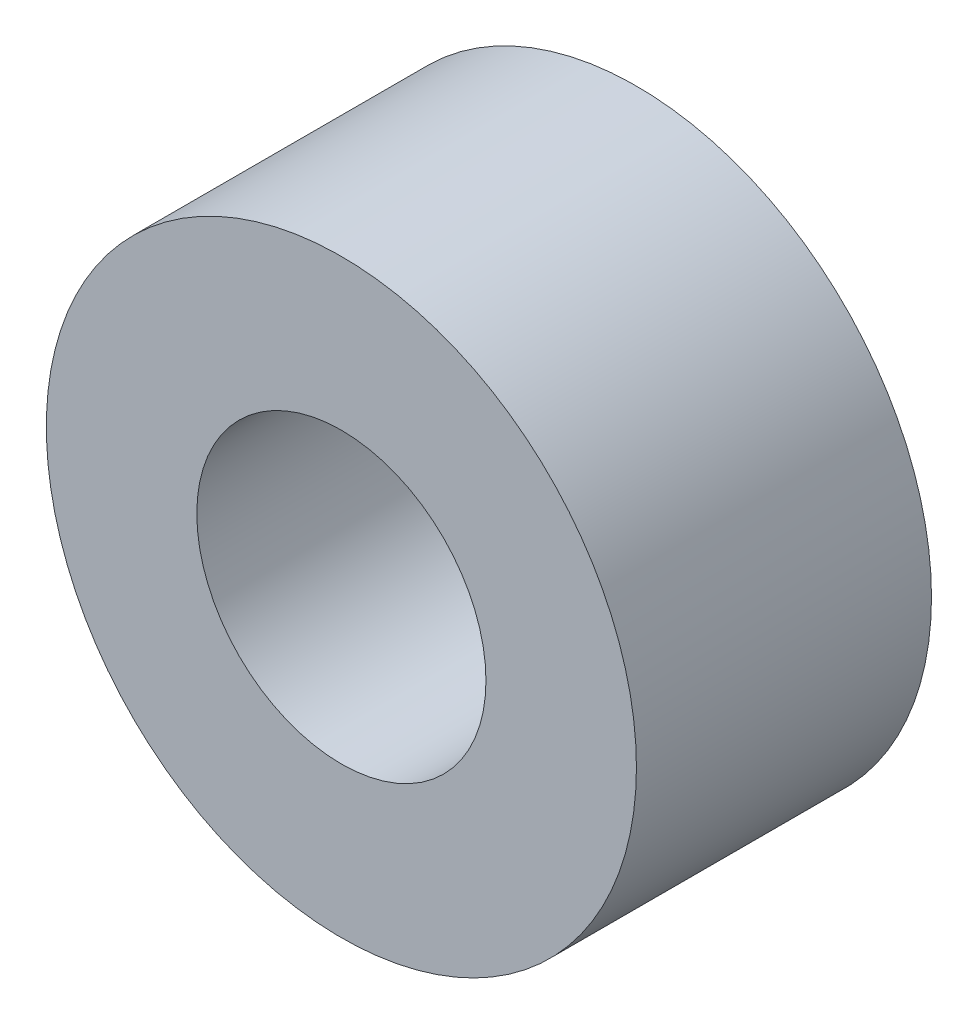
ISO-10303-21;
HEADER;
FILE_DESCRIPTION(('STEP AP214'),'2;1');
FILE_NAME('part.step','',(''),(''),'','','');
FILE_SCHEMA(('AUTOMOTIVE_DESIGN { 1 0 10303 214 1 1 1 1 }'));
ENDSEC;
DATA;
#1=APPLICATION_CONTEXT('core data for automotive mechanical design processes');
#2=APPLICATION_PROTOCOL_DEFINITION('international standard','automotive_design',2000,#1);
#3=PRODUCT_CONTEXT('',#1,'mechanical');
#4=PRODUCT('Part','Part','',(#3));
#5=PRODUCT_RELATED_PRODUCT_CATEGORY('part','',(#4));
#6=PRODUCT_DEFINITION_FORMATION('','',#4);
#7=PRODUCT_DEFINITION_CONTEXT('part definition',#1,'design');
#8=PRODUCT_DEFINITION('design','',#6,#7);
#9=PRODUCT_DEFINITION_SHAPE('','',#8);
#10=(LENGTH_UNIT() NAMED_UNIT(*) SI_UNIT(.MILLI.,.METRE.));
#11=(NAMED_UNIT(*) PLANE_ANGLE_UNIT() SI_UNIT($,.RADIAN.));
#12=(NAMED_UNIT(*) SI_UNIT($,.STERADIAN.) SOLID_ANGLE_UNIT());
#13=UNCERTAINTY_MEASURE_WITH_UNIT(LENGTH_MEASURE(1.E-05),#10,'distance_accuracy_value','');
#14=(GEOMETRIC_REPRESENTATION_CONTEXT(3) GLOBAL_UNCERTAINTY_ASSIGNED_CONTEXT((#13)) GLOBAL_UNIT_ASSIGNED_CONTEXT((#10,
#11,#12)) REPRESENTATION_CONTEXT('',''));
#15=CARTESIAN_POINT('',(0.,0.,0.));
#16=DIRECTION('',(0.,0.,1.));
#17=DIRECTION('',(1.,0.,0.));
#18=AXIS2_PLACEMENT_3D('',#15,#16,#17);
#19=CARTESIAN_POINT('',(0.,0.,5.));
#20=DIRECTION('',(0.,0.,1.));
#21=DIRECTION('',(1.,0.,0.));
#22=AXIS2_PLACEMENT_3D('',#19,#20,#21);
#23=PLANE('',#22);
#24=CARTESIAN_POINT('',(0.,0.,5.));
#25=DIRECTION('',(0.,0.,1.));
#26=DIRECTION('',(1.,0.,0.));
#27=AXIS2_PLACEMENT_3D('',#24,#25,#26);
#28=CIRCLE('',#27,5.);
#29=CARTESIAN_POINT('',(5.,0.,5.));
#30=VERTEX_POINT('',#29);
#31=EDGE_CURVE('E10',#30,#30,#28,.T.);
#32=ORIENTED_EDGE('',*,*,#31,.T.);
#33=EDGE_LOOP('',(#32));
#34=FACE_BOUND('',#33,.T.);
#35=CARTESIAN_POINT('',(0.,0.,5.));
#36=DIRECTION('',(0.,0.,1.));
#37=DIRECTION('',(1.,0.,0.));
#38=AXIS2_PLACEMENT_3D('',#35,#36,#37);
#39=CIRCLE('',#38,2.45);
#40=CARTESIAN_POINT('',(2.45,0.,5.));
#41=VERTEX_POINT('',#40);
#42=EDGE_CURVE('E56',#41,#41,#39,.T.);
#43=ORIENTED_EDGE('',*,*,#42,.F.);
#44=EDGE_LOOP('',(#43));
#45=FACE_BOUND('',#44,.T.);
#46=ADVANCED_FACE('F43',(#34,#45),#23,.T.);
#47=CARTESIAN_POINT('',(0.,0.,0.));
#48=DIRECTION('',(0.,0.,1.));
#49=DIRECTION('',(1.,0.,0.));
#50=AXIS2_PLACEMENT_3D('',#47,#48,#49);
#51=PLANE('',#50);
#52=CARTESIAN_POINT('',(0.,0.,0.));
#53=DIRECTION('',(0.,0.,1.));
#54=DIRECTION('',(1.,0.,0.));
#55=AXIS2_PLACEMENT_3D('',#52,#53,#54);
#56=CIRCLE('',#55,5.);
#57=CARTESIAN_POINT('',(5.,0.,0.));
#58=VERTEX_POINT('',#57);
#59=EDGE_CURVE('E47',#58,#58,#56,.T.);
#60=ORIENTED_EDGE('',*,*,#59,.F.);
#61=EDGE_LOOP('',(#60));
#62=FACE_BOUND('',#61,.T.);
#63=CARTESIAN_POINT('',(0.,0.,0.));
#64=DIRECTION('',(0.,0.,1.));
#65=DIRECTION('',(1.,0.,0.));
#66=AXIS2_PLACEMENT_3D('',#63,#64,#65);
#67=CIRCLE('',#66,2.45);
#68=CARTESIAN_POINT('',(2.45,0.,0.));
#69=VERTEX_POINT('',#68);
#70=EDGE_CURVE('E58',#69,#69,#67,.T.);
#71=ORIENTED_EDGE('',*,*,#70,.T.);
#72=EDGE_LOOP('',(#71));
#73=FACE_BOUND('',#72,.T.);
#74=ADVANCED_FACE('F70',(#62,#73),#51,.F.);
#75=CARTESIAN_POINT('',(0.,0.,5.));
#76=DIRECTION('',(0.,0.,-1.));
#77=DIRECTION('',(-1.,0.,0.));
#78=AXIS2_PLACEMENT_3D('',#75,#76,#77);
#79=CYLINDRICAL_SURFACE('',#78,5.);
#80=ORIENTED_EDGE('',*,*,#31,.F.);
#81=EDGE_LOOP('',(#80));
#82=FACE_BOUND('',#81,.T.);
#83=ORIENTED_EDGE('',*,*,#59,.T.);
#84=EDGE_LOOP('',(#83));
#85=FACE_BOUND('',#84,.T.);
#86=ADVANCED_FACE('F45',(#82,#85),#79,.T.);
#87=CARTESIAN_POINT('',(0.,0.,5.));
#88=DIRECTION('',(0.,0.,-1.));
#89=DIRECTION('',(-1.,0.,0.));
#90=AXIS2_PLACEMENT_3D('',#87,#88,#89);
#91=CYLINDRICAL_SURFACE('',#90,2.45);
#92=ORIENTED_EDGE('',*,*,#42,.T.);
#93=EDGE_LOOP('',(#92));
#94=FACE_BOUND('',#93,.T.);
#95=ORIENTED_EDGE('',*,*,#70,.F.);
#96=EDGE_LOOP('',(#95));
#97=FACE_BOUND('',#96,.T.);
#98=ADVANCED_FACE('F66',(#94,#97),#91,.F.);
#99=CLOSED_SHELL('',(#46,#74,#86,#98));
#100=MANIFOLD_SOLID_BREP('B2',#99);
#101=ADVANCED_BREP_SHAPE_REPRESENTATION('',(#18,#100),#14);
#102=SHAPE_DEFINITION_REPRESENTATION(#9,#101);
ENDSEC;
END-ISO-10303-21;
